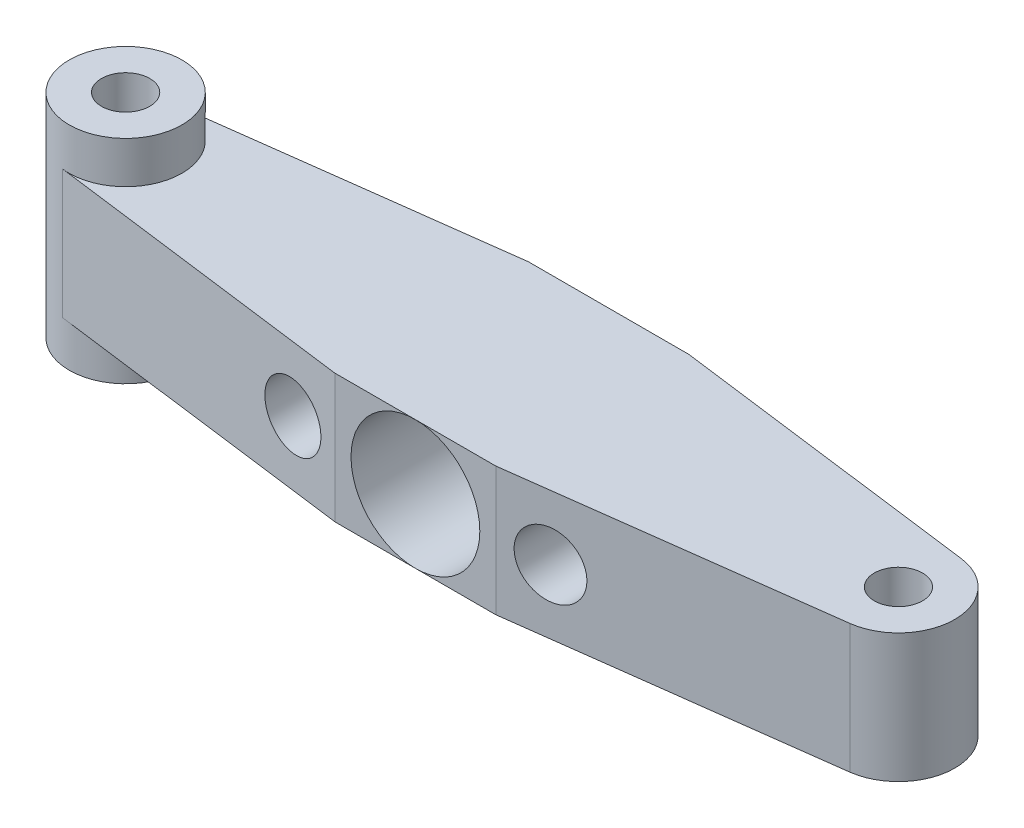
ISO-10303-21;
HEADER;
FILE_DESCRIPTION(('STEP AP214'),'2;1');
FILE_NAME('part.step','',(''),(''),'','','');
FILE_SCHEMA(('AUTOMOTIVE_DESIGN { 1 0 10303 214 1 1 1 1 }'));
ENDSEC;
DATA;
#1=APPLICATION_CONTEXT('core data for automotive mechanical design processes');
#2=APPLICATION_PROTOCOL_DEFINITION('international standard','automotive_design',2000,#1);
#3=PRODUCT_CONTEXT('',#1,'mechanical');
#4=PRODUCT('Part','Part','',(#3));
#5=PRODUCT_RELATED_PRODUCT_CATEGORY('part','',(#4));
#6=PRODUCT_DEFINITION_FORMATION('','',#4);
#7=PRODUCT_DEFINITION_CONTEXT('part definition',#1,'design');
#8=PRODUCT_DEFINITION('design','',#6,#7);
#9=PRODUCT_DEFINITION_SHAPE('','',#8);
#10=(LENGTH_UNIT() NAMED_UNIT(*) SI_UNIT(.MILLI.,.METRE.));
#11=(NAMED_UNIT(*) PLANE_ANGLE_UNIT() SI_UNIT($,.RADIAN.));
#12=(NAMED_UNIT(*) SI_UNIT($,.STERADIAN.) SOLID_ANGLE_UNIT());
#13=UNCERTAINTY_MEASURE_WITH_UNIT(LENGTH_MEASURE(1.E-05),#10,'distance_accuracy_value','');
#14=(GEOMETRIC_REPRESENTATION_CONTEXT(3) GLOBAL_UNCERTAINTY_ASSIGNED_CONTEXT((#13)) GLOBAL_UNIT_ASSIGNED_CONTEXT((#10,
#11,#12)) REPRESENTATION_CONTEXT('',''));
#15=CARTESIAN_POINT('',(0.,0.,0.));
#16=DIRECTION('',(0.,0.,1.));
#17=DIRECTION('',(1.,0.,0.));
#18=AXIS2_PLACEMENT_3D('',#15,#16,#17);
#19=CARTESIAN_POINT('',(-24.,6.6,0.));
#20=DIRECTION('',(0.,1.,0.));
#21=DIRECTION('',(1.,0.,0.));
#22=AXIS2_PLACEMENT_3D('',#19,#20,#21);
#23=PLANE('',#22);
#24=CARTESIAN_POINT('',(-24.,6.6,0.));
#25=DIRECTION('',(0.,-1.,0.));
#26=DIRECTION('',(0.,0.,-1.));
#27=AXIS2_PLACEMENT_3D('',#24,#25,#26);
#28=CIRCLE('',#27,1.5);
#29=CARTESIAN_POINT('',(-24.,6.6,1.5));
#30=VERTEX_POINT('',#29);
#31=EDGE_CURVE('E176',#30,#30,#28,.T.);
#32=ORIENTED_EDGE('',*,*,#31,.T.);
#33=EDGE_LOOP('',(#32));
#34=FACE_BOUND('',#33,.T.);
#35=CARTESIAN_POINT('',(-24.,6.6,0.));
#36=DIRECTION('',(0.,-1.,0.));
#37=DIRECTION('',(0.,0.,-1.));
#38=AXIS2_PLACEMENT_3D('',#35,#36,#37);
#39=CIRCLE('',#38,3.5);
#40=CARTESIAN_POINT('',(-24.,6.6,3.5));
#41=VERTEX_POINT('',#40);
#42=EDGE_CURVE('E244',#41,#41,#39,.T.);
#43=ORIENTED_EDGE('',*,*,#42,.F.);
#44=EDGE_LOOP('',(#43));
#45=FACE_BOUND('',#44,.T.);
#46=ADVANCED_FACE('F17',(#34,#45),#23,.T.);
#47=CARTESIAN_POINT('',(-24.,-6.6,0.));
#48=DIRECTION('',(0.,-1.,0.));
#49=DIRECTION('',(0.,0.,-1.));
#50=AXIS2_PLACEMENT_3D('',#47,#48,#49);
#51=PLANE('',#50);
#52=CARTESIAN_POINT('',(-24.,-6.6,0.));
#53=DIRECTION('',(0.,1.,0.));
#54=DIRECTION('',(0.,0.,-1.));
#55=AXIS2_PLACEMENT_3D('',#52,#53,#54);
#56=CIRCLE('',#55,1.5);
#57=CARTESIAN_POINT('',(-24.,-6.6,1.5));
#58=VERTEX_POINT('',#57);
#59=EDGE_CURVE('E256',#58,#58,#56,.T.);
#60=ORIENTED_EDGE('',*,*,#59,.T.);
#61=EDGE_LOOP('',(#60));
#62=FACE_BOUND('',#61,.T.);
#63=CARTESIAN_POINT('',(-24.,-6.6,0.));
#64=DIRECTION('',(0.,1.,0.));
#65=DIRECTION('',(0.,0.,-1.));
#66=AXIS2_PLACEMENT_3D('',#63,#64,#65);
#67=CIRCLE('',#66,3.5);
#68=CARTESIAN_POINT('',(-24.,-6.6,3.5));
#69=VERTEX_POINT('',#68);
#70=EDGE_CURVE('E182',#69,#69,#67,.T.);
#71=ORIENTED_EDGE('',*,*,#70,.F.);
#72=EDGE_LOOP('',(#71));
#73=FACE_BOUND('',#72,.T.);
#74=ADVANCED_FACE('F426',(#62,#73),#51,.T.);
#75=CARTESIAN_POINT('',(24.,4.,0.));
#76=DIRECTION('',(0.,-1.,0.));
#77=DIRECTION('',(0.,0.,-1.));
#78=AXIS2_PLACEMENT_3D('',#75,#76,#77);
#79=PLANE('',#78);
#80=CARTESIAN_POINT('',(24.,4.,0.));
#81=DIRECTION('',(0.,-1.,0.));
#82=DIRECTION('',(0.,0.,-1.));
#83=AXIS2_PLACEMENT_3D('',#80,#81,#82);
#84=CIRCLE('',#83,1.5);
#85=CARTESIAN_POINT('',(24.,4.,1.5));
#86=VERTEX_POINT('',#85);
#87=EDGE_CURVE('E192',#86,#86,#84,.T.);
#88=ORIENTED_EDGE('',*,*,#87,.T.);
#89=EDGE_LOOP('',(#88));
#90=FACE_BOUND('',#89,.T.);
#91=CARTESIAN_POINT('',(-24.,4.,0.));
#92=DIRECTION('',(0.,1.,0.));
#93=DIRECTION('',(0.,0.,-1.));
#94=AXIS2_PLACEMENT_3D('',#91,#92,#93);
#95=CIRCLE('',#94,3.5);
#96=CARTESIAN_POINT('',(-24.4512996225804,4.,3.47078213817295));
#97=VERTEX_POINT('',#96);
#98=CARTESIAN_POINT('',(-24.,4.,3.5));
#99=VERTEX_POINT('',#98);
#100=EDGE_CURVE('E245',#97,#99,#95,.T.);
#101=ORIENTED_EDGE('',*,*,#100,.F.);
#102=DIRECTION('',(0.991652039477905,0.,0.128942749308801));
#103=VECTOR('',#102,1.);
#104=CARTESIAN_POINT('',(-24.45129962258,4.,3.470782138173));
#105=LINE('',#104,#103);
#106=CARTESIAN_POINT('',(-5.,4.,6.));
#107=VERTEX_POINT('',#106);
#108=EDGE_CURVE('E186',#97,#107,#105,.T.);
#109=ORIENTED_EDGE('',*,*,#108,.T.);
#110=DIRECTION('',(1.,0.,0.));
#111=VECTOR('',#110,1.);
#112=CARTESIAN_POINT('',(-5.,4.,6.));
#113=LINE('',#112,#111);
#114=CARTESIAN_POINT('',(0.,4.,6.));
#115=VERTEX_POINT('',#114);
#116=EDGE_CURVE('E11',#107,#115,#113,.T.);
#117=ORIENTED_EDGE('',*,*,#116,.T.);
#118=DIRECTION('',(1.,0.,0.));
#119=VECTOR('',#118,1.);
#120=CARTESIAN_POINT('',(-5.,4.,6.));
#121=LINE('',#120,#119);
#122=CARTESIAN_POINT('',(5.,4.,6.));
#123=VERTEX_POINT('',#122);
#124=EDGE_CURVE('E250',#115,#123,#121,.T.);
#125=ORIENTED_EDGE('',*,*,#124,.T.);
#126=DIRECTION('',(0.991652039477905,0.,-0.128942749308801));
#127=VECTOR('',#126,1.);
#128=CARTESIAN_POINT('',(24.45129962258,4.,3.470782138173));
#129=LINE('',#128,#127);
#130=CARTESIAN_POINT('',(24.4512996225804,4.,3.47078213817295));
#131=VERTEX_POINT('',#130);
#132=EDGE_CURVE('E246',#123,#131,#129,.T.);
#133=ORIENTED_EDGE('',*,*,#132,.T.);
#134=CARTESIAN_POINT('',(24.,4.,0.));
#135=DIRECTION('',(0.,-1.,0.));
#136=DIRECTION('',(0.,0.,-1.));
#137=AXIS2_PLACEMENT_3D('',#134,#135,#136);
#138=CIRCLE('',#137,3.5);
#139=CARTESIAN_POINT('',(24.4512996225804,4.,-3.47078213817283));
#140=VERTEX_POINT('',#139);
#141=EDGE_CURVE('E207',#140,#131,#138,.T.);
#142=ORIENTED_EDGE('',*,*,#141,.F.);
#143=DIRECTION('',(-0.991652039477905,0.,-0.128942749308801));
#144=VECTOR('',#143,1.);
#145=CARTESIAN_POINT('',(24.45129962258,4.,-3.470782138173));
#146=LINE('',#145,#144);
#147=CARTESIAN_POINT('',(5.,4.,-6.));
#148=VERTEX_POINT('',#147);
#149=EDGE_CURVE('E222',#140,#148,#146,.T.);
#150=ORIENTED_EDGE('',*,*,#149,.T.);
#151=DIRECTION('',(-1.,0.,0.));
#152=VECTOR('',#151,1.);
#153=CARTESIAN_POINT('',(-5.,4.,-6.));
#154=LINE('',#153,#152);
#155=CARTESIAN_POINT('',(0.,4.,-6.));
#156=VERTEX_POINT('',#155);
#157=EDGE_CURVE('E197',#148,#156,#154,.T.);
#158=ORIENTED_EDGE('',*,*,#157,.T.);
#159=DIRECTION('',(-1.,0.,0.));
#160=VECTOR('',#159,1.);
#161=CARTESIAN_POINT('',(-5.,4.,-6.));
#162=LINE('',#161,#160);
#163=CARTESIAN_POINT('',(-5.,4.,-6.));
#164=VERTEX_POINT('',#163);
#165=EDGE_CURVE('E196',#156,#164,#162,.T.);
#166=ORIENTED_EDGE('',*,*,#165,.T.);
#167=DIRECTION('',(-0.991652039477905,0.,0.128942749308801));
#168=VECTOR('',#167,1.);
#169=CARTESIAN_POINT('',(-24.45129962258,4.,-3.470782138173));
#170=LINE('',#169,#168);
#171=CARTESIAN_POINT('',(-24.4512996225804,4.,-3.47078213817295));
#172=VERTEX_POINT('',#171);
#173=EDGE_CURVE('E212',#164,#172,#170,.T.);
#174=ORIENTED_EDGE('',*,*,#173,.T.);
#175=CARTESIAN_POINT('',(-24.,4.,0.));
#176=DIRECTION('',(0.,1.,0.));
#177=DIRECTION('',(0.,0.,-1.));
#178=AXIS2_PLACEMENT_3D('',#175,#176,#177);
#179=CIRCLE('',#178,3.5);
#180=EDGE_CURVE('E281',#99,#172,#179,.T.);
#181=ORIENTED_EDGE('',*,*,#180,.F.);
#182=EDGE_LOOP('',(#101,#109,#117,#125,#133,#142,#150,#158,#166,#174,#181));
#183=FACE_BOUND('',#182,.T.);
#184=ADVANCED_FACE('F320',(#90,#183),#79,.F.);
#185=CARTESIAN_POINT('',(-5.,4.,6.));
#186=DIRECTION('',(0.,0.,-1.));
#187=DIRECTION('',(0.,-1.,0.));
#188=AXIS2_PLACEMENT_3D('',#185,#186,#187);
#189=PLANE('',#188);
#190=DIRECTION('',(0.,-1.,0.));
#191=VECTOR('',#190,1.);
#192=CARTESIAN_POINT('',(-5.,4.,6.));
#193=LINE('',#192,#191);
#194=CARTESIAN_POINT('',(-4.99999999999981,-4.,6.));
#195=VERTEX_POINT('',#194);
#196=EDGE_CURVE('E28',#107,#195,#193,.T.);
#197=ORIENTED_EDGE('',*,*,#196,.T.);
#198=DIRECTION('',(-1.,0.,0.));
#199=VECTOR('',#198,1.);
#200=CARTESIAN_POINT('',(24.,-4.,6.));
#201=LINE('',#200,#199);
#202=CARTESIAN_POINT('',(0.,-4.,6.));
#203=VERTEX_POINT('',#202);
#204=EDGE_CURVE('E239',#203,#195,#201,.T.);
#205=ORIENTED_EDGE('',*,*,#204,.F.);
#206=CARTESIAN_POINT('',(0.,0.,6.));
#207=DIRECTION('',(0.,0.,1.));
#208=DIRECTION('',(1.,0.,0.));
#209=AXIS2_PLACEMENT_3D('',#206,#207,#208);
#210=CIRCLE('',#209,4.);
#211=CARTESIAN_POINT('',(-4.,0.,6.));
#212=VERTEX_POINT('',#211);
#213=EDGE_CURVE('E230',#212,#203,#210,.T.);
#214=ORIENTED_EDGE('',*,*,#213,.F.);
#215=CARTESIAN_POINT('',(0.,0.,6.));
#216=DIRECTION('',(0.,0.,1.));
#217=DIRECTION('',(1.,0.,0.));
#218=AXIS2_PLACEMENT_3D('',#215,#216,#217);
#219=CIRCLE('',#218,4.);
#220=EDGE_CURVE('E198',#115,#212,#219,.T.);
#221=ORIENTED_EDGE('',*,*,#220,.F.);
#222=ORIENTED_EDGE('',*,*,#116,.F.);
#223=EDGE_LOOP('',(#197,#205,#214,#221,#222));
#224=FACE_BOUND('',#223,.T.);
#225=ADVANCED_FACE('F372',(#224),#189,.F.);
#226=CARTESIAN_POINT('',(-24.45129962258,4.,3.470782138173));
#227=DIRECTION('',(0.128942749308801,0.,-0.991652039477905));
#228=DIRECTION('',(0.,-1.,0.));
#229=AXIS2_PLACEMENT_3D('',#226,#227,#228);
#230=PLANE('',#229);
#231=CARTESIAN_POINT('',(-8.,0.,5.60991534073781));
#232=DIRECTION('',(-0.128942749308801,0.,0.991652039477905));
#233=DIRECTION('',(0.991652039477905,0.,0.128942749308801));
#234=AXIS2_PLACEMENT_3D('',#231,#232,#233);
#235=ELLIPSE('',#234,2.01683647124145,2.);
#236=CARTESIAN_POINT('',(-10.,0.,5.34985890122968));
#237=VERTEX_POINT('',#236);
#238=EDGE_CURVE('E168',#237,#237,#235,.T.);
#239=ORIENTED_EDGE('',*,*,#238,.F.);
#240=EDGE_LOOP('',(#239));
#241=FACE_BOUND('',#240,.T.);
#242=ORIENTED_EDGE('',*,*,#108,.F.);
#243=DIRECTION('',(0.,1.,0.));
#244=VECTOR('',#243,1.);
#245=CARTESIAN_POINT('',(-24.45129962258,4.,3.470782138173));
#246=LINE('',#245,#244);
#247=CARTESIAN_POINT('',(-24.4512996225804,-4.,3.47078213817295));
#248=VERTEX_POINT('',#247);
#249=EDGE_CURVE('E262',#248,#97,#246,.T.);
#250=ORIENTED_EDGE('',*,*,#249,.F.);
#251=DIRECTION('',(-0.991652039477905,0.,-0.1289427493088));
#252=VECTOR('',#251,1.);
#253=CARTESIAN_POINT('',(-5.,-4.,6.));
#254=LINE('',#253,#252);
#255=EDGE_CURVE('E234',#195,#248,#254,.T.);
#256=ORIENTED_EDGE('',*,*,#255,.F.);
#257=ORIENTED_EDGE('',*,*,#196,.F.);
#258=EDGE_LOOP('',(#242,#250,#256,#257));
#259=FACE_BOUND('',#258,.T.);
#260=ADVANCED_FACE('F375',(#241,#259),#230,.F.);
#261=CARTESIAN_POINT('',(-24.45129962258,4.,-3.470782138173));
#262=DIRECTION('',(0.128942749308801,0.,0.991652039477905));
#263=DIRECTION('',(0.,-1.,0.));
#264=AXIS2_PLACEMENT_3D('',#261,#262,#263);
#265=PLANE('',#264);
#266=CARTESIAN_POINT('',(-8.,0.,-5.60991534073781));
#267=DIRECTION('',(-0.128942749308801,0.,-0.991652039477905));
#268=DIRECTION('',(0.991652039477905,0.,-0.128942749308801));
#269=AXIS2_PLACEMENT_3D('',#266,#267,#268);
#270=ELLIPSE('',#269,2.01683647124145,2.);
#271=CARTESIAN_POINT('',(-10.,0.,-5.34985890122968));
#272=VERTEX_POINT('',#271);
#273=EDGE_CURVE('E166',#272,#272,#270,.T.);
#274=ORIENTED_EDGE('',*,*,#273,.F.);
#275=EDGE_LOOP('',(#274));
#276=FACE_BOUND('',#275,.T.);
#277=ORIENTED_EDGE('',*,*,#173,.F.);
#278=DIRECTION('',(0.,-1.,0.));
#279=VECTOR('',#278,1.);
#280=CARTESIAN_POINT('',(-5.,4.,-6.));
#281=LINE('',#280,#279);
#282=CARTESIAN_POINT('',(-5.,-4.,-6.));
#283=VERTEX_POINT('',#282);
#284=EDGE_CURVE('E193',#164,#283,#281,.T.);
#285=ORIENTED_EDGE('',*,*,#284,.T.);
#286=DIRECTION('',(0.991652039477905,0.,-0.1289427493088));
#287=VECTOR('',#286,1.);
#288=CARTESIAN_POINT('',(-24.45129962258,-4.,-3.470782138173));
#289=LINE('',#288,#287);
#290=CARTESIAN_POINT('',(-24.4512996225804,-4.,-3.47078213817295));
#291=VERTEX_POINT('',#290);
#292=EDGE_CURVE('E238',#291,#283,#289,.T.);
#293=ORIENTED_EDGE('',*,*,#292,.F.);
#294=DIRECTION('',(0.,-1.,0.));
#295=VECTOR('',#294,1.);
#296=CARTESIAN_POINT('',(-24.45129962258,4.,-3.470782138173));
#297=LINE('',#296,#295);
#298=EDGE_CURVE('E290',#172,#291,#297,.T.);
#299=ORIENTED_EDGE('',*,*,#298,.F.);
#300=EDGE_LOOP('',(#277,#285,#293,#299));
#301=FACE_BOUND('',#300,.T.);
#302=ADVANCED_FACE('F412',(#276,#301),#265,.F.);
#303=CARTESIAN_POINT('',(-5.,4.,-6.));
#304=DIRECTION('',(0.,0.,1.));
#305=DIRECTION('',(1.,0.,0.));
#306=AXIS2_PLACEMENT_3D('',#303,#304,#305);
#307=PLANE('',#306);
#308=DIRECTION('',(1.,0.,0.));
#309=VECTOR('',#308,1.);
#310=CARTESIAN_POINT('',(24.,-4.,-6.));
#311=LINE('',#310,#309);
#312=CARTESIAN_POINT('',(0.,-4.,-6.));
#313=VERTEX_POINT('',#312);
#314=EDGE_CURVE('E331',#283,#313,#311,.T.);
#315=ORIENTED_EDGE('',*,*,#314,.F.);
#316=ORIENTED_EDGE('',*,*,#284,.F.);
#317=ORIENTED_EDGE('',*,*,#165,.F.);
#318=CARTESIAN_POINT('',(0.,0.,-6.));
#319=DIRECTION('',(0.,0.,-1.));
#320=DIRECTION('',(1.,0.,0.));
#321=AXIS2_PLACEMENT_3D('',#318,#319,#320);
#322=CIRCLE('',#321,4.);
#323=CARTESIAN_POINT('',(-4.,0.,-6.));
#324=VERTEX_POINT('',#323);
#325=EDGE_CURVE('E201',#324,#156,#322,.T.);
#326=ORIENTED_EDGE('',*,*,#325,.F.);
#327=CARTESIAN_POINT('',(0.,0.,-6.));
#328=DIRECTION('',(0.,0.,-1.));
#329=DIRECTION('',(1.,0.,0.));
#330=AXIS2_PLACEMENT_3D('',#327,#328,#329);
#331=CIRCLE('',#330,4.);
#332=EDGE_CURVE('E401',#313,#324,#331,.T.);
#333=ORIENTED_EDGE('',*,*,#332,.F.);
#334=EDGE_LOOP('',(#315,#316,#317,#326,#333));
#335=FACE_BOUND('',#334,.T.);
#336=ADVANCED_FACE('F414',(#335),#307,.F.);
#337=CARTESIAN_POINT('',(-5.,4.,-6.));
#338=DIRECTION('',(0.,0.,1.));
#339=DIRECTION('',(1.,0.,0.));
#340=AXIS2_PLACEMENT_3D('',#337,#338,#339);
#341=PLANE('',#340);
#342=DIRECTION('',(0.,-1.,0.));
#343=VECTOR('',#342,1.);
#344=CARTESIAN_POINT('',(5.,4.,-6.));
#345=LINE('',#344,#343);
#346=CARTESIAN_POINT('',(5.,-4.,-6.));
#347=VERTEX_POINT('',#346);
#348=EDGE_CURVE('E226',#148,#347,#345,.T.);
#349=ORIENTED_EDGE('',*,*,#348,.T.);
#350=DIRECTION('',(1.,0.,0.));
#351=VECTOR('',#350,1.);
#352=CARTESIAN_POINT('',(24.,-4.,-6.));
#353=LINE('',#352,#351);
#354=EDGE_CURVE('E275',#313,#347,#353,.T.);
#355=ORIENTED_EDGE('',*,*,#354,.F.);
#356=CARTESIAN_POINT('',(0.,0.,-6.));
#357=DIRECTION('',(0.,0.,-1.));
#358=DIRECTION('',(1.,0.,0.));
#359=AXIS2_PLACEMENT_3D('',#356,#357,#358);
#360=CIRCLE('',#359,4.);
#361=EDGE_CURVE('E289',#156,#313,#360,.T.);
#362=ORIENTED_EDGE('',*,*,#361,.F.);
#363=ORIENTED_EDGE('',*,*,#157,.F.);
#364=EDGE_LOOP('',(#349,#355,#362,#363));
#365=FACE_BOUND('',#364,.T.);
#366=ADVANCED_FACE('F312',(#365),#341,.F.);
#367=CARTESIAN_POINT('',(24.45129962258,4.,-3.470782138173));
#368=DIRECTION('',(-0.128942749308801,0.,0.991652039477905));
#369=DIRECTION('',(0.,1.,0.));
#370=AXIS2_PLACEMENT_3D('',#367,#368,#369);
#371=PLANE('',#370);
#372=CARTESIAN_POINT('',(8.,0.,-5.60991534073781));
#373=DIRECTION('',(0.128942749308801,0.,-0.991652039477905));
#374=DIRECTION('',(0.991652039477905,0.,0.128942749308801));
#375=AXIS2_PLACEMENT_3D('',#372,#373,#374);
#376=ELLIPSE('',#375,2.01683647124145,2.);
#377=CARTESIAN_POINT('',(6.,0.,-5.86997178024595));
#378=VERTEX_POINT('',#377);
#379=EDGE_CURVE('E270',#378,#378,#376,.T.);
#380=ORIENTED_EDGE('',*,*,#379,.F.);
#381=EDGE_LOOP('',(#380));
#382=FACE_BOUND('',#381,.T.);
#383=ORIENTED_EDGE('',*,*,#149,.F.);
#384=DIRECTION('',(0.,1.,0.));
#385=VECTOR('',#384,1.);
#386=CARTESIAN_POINT('',(24.45129962258,4.,-3.47078213817277));
#387=LINE('',#386,#385);
#388=CARTESIAN_POINT('',(24.4512996225804,-4.,-3.47078213817283));
#389=VERTEX_POINT('',#388);
#390=EDGE_CURVE('E203',#389,#140,#387,.T.);
#391=ORIENTED_EDGE('',*,*,#390,.F.);
#392=DIRECTION('',(0.991652039477905,0.,0.1289427493088));
#393=VECTOR('',#392,1.);
#394=CARTESIAN_POINT('',(5.,-4.,-6.));
#395=LINE('',#394,#393);
#396=EDGE_CURVE('E218',#347,#389,#395,.T.);
#397=ORIENTED_EDGE('',*,*,#396,.F.);
#398=ORIENTED_EDGE('',*,*,#348,.F.);
#399=EDGE_LOOP('',(#383,#391,#397,#398));
#400=FACE_BOUND('',#399,.T.);
#401=ADVANCED_FACE('F308',(#382,#400),#371,.F.);
#402=CARTESIAN_POINT('',(24.,4.,0.));
#403=DIRECTION('',(0.,-1.,0.));
#404=DIRECTION('',(0.,0.,-1.));
#405=AXIS2_PLACEMENT_3D('',#402,#403,#404);
#406=CYLINDRICAL_SURFACE('',#405,3.5);
#407=DIRECTION('',(0.,-1.,0.));
#408=VECTOR('',#407,1.);
#409=CARTESIAN_POINT('',(24.45129962258,4.,3.470782138173));
#410=LINE('',#409,#408);
#411=CARTESIAN_POINT('',(24.4512996225804,-4.,3.47078213817295));
#412=VERTEX_POINT('',#411);
#413=EDGE_CURVE('E208',#131,#412,#410,.T.);
#414=ORIENTED_EDGE('',*,*,#413,.T.);
#415=CARTESIAN_POINT('',(24.,-4.,0.));
#416=DIRECTION('',(0.,-1.,0.));
#417=DIRECTION('',(0.,0.,-1.));
#418=AXIS2_PLACEMENT_3D('',#415,#416,#417);
#419=CIRCLE('',#418,3.5);
#420=EDGE_CURVE('E213',#389,#412,#419,.T.);
#421=ORIENTED_EDGE('',*,*,#420,.F.);
#422=ORIENTED_EDGE('',*,*,#390,.T.);
#423=ORIENTED_EDGE('',*,*,#141,.T.);
#424=EDGE_LOOP('',(#414,#421,#422,#423));
#425=FACE_BOUND('',#424,.T.);
#426=ADVANCED_FACE('F311',(#425),#406,.T.);
#427=CARTESIAN_POINT('',(24.45129962258,4.,3.470782138173));
#428=DIRECTION('',(-0.128942749308801,0.,-0.991652039477905));
#429=DIRECTION('',(-0.991652039477905,0.,0.128942749308801));
#430=AXIS2_PLACEMENT_3D('',#427,#428,#429);
#431=PLANE('',#430);
#432=CARTESIAN_POINT('',(8.,0.,5.60991534073781));
#433=DIRECTION('',(0.128942749308801,0.,0.991652039477905));
#434=DIRECTION('',(0.991652039477905,0.,-0.128942749308801));
#435=AXIS2_PLACEMENT_3D('',#432,#433,#434);
#436=ELLIPSE('',#435,2.01683647124145,2.);
#437=CARTESIAN_POINT('',(6.,0.,5.86997178024594));
#438=VERTEX_POINT('',#437);
#439=EDGE_CURVE('E178',#438,#438,#436,.T.);
#440=ORIENTED_EDGE('',*,*,#439,.F.);
#441=EDGE_LOOP('',(#440));
#442=FACE_BOUND('',#441,.T.);
#443=ORIENTED_EDGE('',*,*,#132,.F.);
#444=DIRECTION('',(0.,-1.,0.));
#445=VECTOR('',#444,1.);
#446=CARTESIAN_POINT('',(5.,4.,6.));
#447=LINE('',#446,#445);
#448=CARTESIAN_POINT('',(5.,-4.,6.));
#449=VERTEX_POINT('',#448);
#450=EDGE_CURVE('E217',#123,#449,#447,.T.);
#451=ORIENTED_EDGE('',*,*,#450,.T.);
#452=DIRECTION('',(-0.991652039477905,0.,0.1289427493088));
#453=VECTOR('',#452,1.);
#454=CARTESIAN_POINT('',(24.45129962258,-4.,3.470782138173));
#455=LINE('',#454,#453);
#456=EDGE_CURVE('E251',#412,#449,#455,.T.);
#457=ORIENTED_EDGE('',*,*,#456,.F.);
#458=ORIENTED_EDGE('',*,*,#413,.F.);
#459=EDGE_LOOP('',(#443,#451,#457,#458));
#460=FACE_BOUND('',#459,.T.);
#461=ADVANCED_FACE('F436',(#442,#460),#431,.F.);
#462=CARTESIAN_POINT('',(-5.,4.,6.));
#463=DIRECTION('',(0.,0.,-1.));
#464=DIRECTION('',(0.,-1.,0.));
#465=AXIS2_PLACEMENT_3D('',#462,#463,#464);
#466=PLANE('',#465);
#467=DIRECTION('',(-1.,0.,0.));
#468=VECTOR('',#467,1.);
#469=CARTESIAN_POINT('',(24.,-4.,6.));
#470=LINE('',#469,#468);
#471=EDGE_CURVE('E255',#449,#203,#470,.T.);
#472=ORIENTED_EDGE('',*,*,#471,.F.);
#473=ORIENTED_EDGE('',*,*,#450,.F.);
#474=ORIENTED_EDGE('',*,*,#124,.F.);
#475=CARTESIAN_POINT('',(0.,0.,6.));
#476=DIRECTION('',(0.,0.,1.));
#477=DIRECTION('',(1.,0.,0.));
#478=AXIS2_PLACEMENT_3D('',#475,#476,#477);
#479=CIRCLE('',#478,4.);
#480=EDGE_CURVE('E202',#203,#115,#479,.T.);
#481=ORIENTED_EDGE('',*,*,#480,.F.);
#482=EDGE_LOOP('',(#472,#473,#474,#481));
#483=FACE_BOUND('',#482,.T.);
#484=ADVANCED_FACE('F439',(#483),#466,.F.);
#485=CARTESIAN_POINT('',(24.,-4.,0.));
#486=DIRECTION('',(0.,-1.,0.));
#487=DIRECTION('',(0.,0.,-1.));
#488=AXIS2_PLACEMENT_3D('',#485,#486,#487);
#489=PLANE('',#488);
#490=CARTESIAN_POINT('',(24.,-4.,0.));
#491=DIRECTION('',(0.,1.,0.));
#492=DIRECTION('',(0.,0.,-1.));
#493=AXIS2_PLACEMENT_3D('',#490,#491,#492);
#494=CIRCLE('',#493,1.5);
#495=CARTESIAN_POINT('',(24.,-4.,1.5));
#496=VERTEX_POINT('',#495);
#497=EDGE_CURVE('E191',#496,#496,#494,.T.);
#498=ORIENTED_EDGE('',*,*,#497,.T.);
#499=EDGE_LOOP('',(#498));
#500=FACE_BOUND('',#499,.T.);
#501=ORIENTED_EDGE('',*,*,#456,.T.);
#502=ORIENTED_EDGE('',*,*,#471,.T.);
#503=ORIENTED_EDGE('',*,*,#204,.T.);
#504=ORIENTED_EDGE('',*,*,#255,.T.);
#505=CARTESIAN_POINT('',(-24.,-4.,0.));
#506=DIRECTION('',(0.,1.,0.));
#507=DIRECTION('',(0.,0.,-1.));
#508=AXIS2_PLACEMENT_3D('',#505,#506,#507);
#509=CIRCLE('',#508,3.5);
#510=CARTESIAN_POINT('',(-24.,-4.,3.5));
#511=VERTEX_POINT('',#510);
#512=EDGE_CURVE('E263',#248,#511,#509,.T.);
#513=ORIENTED_EDGE('',*,*,#512,.T.);
#514=CARTESIAN_POINT('',(-24.,-4.,0.));
#515=DIRECTION('',(0.,1.,0.));
#516=DIRECTION('',(0.,0.,-1.));
#517=AXIS2_PLACEMENT_3D('',#514,#515,#516);
#518=CIRCLE('',#517,3.5);
#519=EDGE_CURVE('E285',#511,#291,#518,.T.);
#520=ORIENTED_EDGE('',*,*,#519,.T.);
#521=ORIENTED_EDGE('',*,*,#292,.T.);
#522=ORIENTED_EDGE('',*,*,#314,.T.);
#523=ORIENTED_EDGE('',*,*,#354,.T.);
#524=ORIENTED_EDGE('',*,*,#396,.T.);
#525=ORIENTED_EDGE('',*,*,#420,.T.);
#526=EDGE_LOOP('',(#501,#502,#503,#504,#513,#520,#521,#522,#523,#524,#525));
#527=FACE_BOUND('',#526,.T.);
#528=ADVANCED_FACE('F327',(#500,#527),#489,.T.);
#529=CARTESIAN_POINT('',(-24.,4.,0.));
#530=DIRECTION('',(0.,-1.,0.));
#531=DIRECTION('',(0.,0.,-1.));
#532=AXIS2_PLACEMENT_3D('',#529,#530,#531);
#533=CYLINDRICAL_SURFACE('',#532,1.5);
#534=ORIENTED_EDGE('',*,*,#31,.F.);
#535=DIRECTION('',(0.,-1.,0.));
#536=VECTOR('',#535,1.);
#537=CARTESIAN_POINT('',(-24.,4.,1.5));
#538=LINE('',#537,#536);
#539=EDGE_CURVE('E294',#30,#58,#538,.T.);
#540=ORIENTED_EDGE('',*,*,#539,.T.);
#541=ORIENTED_EDGE('',*,*,#59,.F.);
#542=ORIENTED_EDGE('',*,*,#539,.F.);
#543=EDGE_LOOP('',(#534,#540,#541,#542));
#544=FACE_BOUND('',#543,.T.);
#545=ADVANCED_FACE('F454',(#544),#533,.F.);
#546=CARTESIAN_POINT('',(-8.,0.,-6.));
#547=DIRECTION('',(0.,0.,1.));
#548=DIRECTION('',(1.,0.,0.));
#549=AXIS2_PLACEMENT_3D('',#546,#547,#548);
#550=CYLINDRICAL_SURFACE('',#549,2.);
#551=ORIENTED_EDGE('',*,*,#273,.T.);
#552=DIRECTION('',(0.,0.,1.));
#553=VECTOR('',#552,1.);
#554=CARTESIAN_POINT('',(-10.,0.,-6.));
#555=LINE('',#554,#553);
#556=EDGE_CURVE('E163',#272,#237,#555,.T.);
#557=ORIENTED_EDGE('',*,*,#556,.T.);
#558=ORIENTED_EDGE('',*,*,#238,.T.);
#559=ORIENTED_EDGE('',*,*,#556,.F.);
#560=EDGE_LOOP('',(#551,#557,#558,#559));
#561=FACE_BOUND('',#560,.T.);
#562=ADVANCED_FACE('F164',(#561),#550,.F.);
#563=CARTESIAN_POINT('',(8.,0.,-6.));
#564=DIRECTION('',(0.,0.,1.));
#565=DIRECTION('',(1.,0.,0.));
#566=AXIS2_PLACEMENT_3D('',#563,#564,#565);
#567=CYLINDRICAL_SURFACE('',#566,2.);
#568=ORIENTED_EDGE('',*,*,#379,.T.);
#569=DIRECTION('',(0.,0.,1.));
#570=VECTOR('',#569,1.);
#571=CARTESIAN_POINT('',(6.,0.,-6.));
#572=LINE('',#571,#570);
#573=EDGE_CURVE('E229',#378,#438,#572,.T.);
#574=ORIENTED_EDGE('',*,*,#573,.T.);
#575=ORIENTED_EDGE('',*,*,#439,.T.);
#576=ORIENTED_EDGE('',*,*,#573,.F.);
#577=EDGE_LOOP('',(#568,#574,#575,#576));
#578=FACE_BOUND('',#577,.T.);
#579=ADVANCED_FACE('F306',(#578),#567,.F.);
#580=CARTESIAN_POINT('',(0.,0.,-6.));
#581=DIRECTION('',(0.,0.,1.));
#582=DIRECTION('',(1.,0.,0.));
#583=AXIS2_PLACEMENT_3D('',#580,#581,#582);
#584=CYLINDRICAL_SURFACE('',#583,4.);
#585=ORIENTED_EDGE('',*,*,#361,.T.);
#586=ORIENTED_EDGE('',*,*,#332,.T.);
#587=DIRECTION('',(0.,0.,1.));
#588=VECTOR('',#587,1.);
#589=CARTESIAN_POINT('',(-4.,0.,-6.));
#590=LINE('',#589,#588);
#591=EDGE_CURVE('E21',#324,#212,#590,.T.);
#592=ORIENTED_EDGE('',*,*,#591,.T.);
#593=ORIENTED_EDGE('',*,*,#213,.T.);
#594=ORIENTED_EDGE('',*,*,#480,.T.);
#595=ORIENTED_EDGE('',*,*,#220,.T.);
#596=ORIENTED_EDGE('',*,*,#591,.F.);
#597=ORIENTED_EDGE('',*,*,#325,.T.);
#598=EDGE_LOOP('',(#585,#586,#592,#593,#594,#595,#596,#597));
#599=FACE_BOUND('',#598,.T.);
#600=ADVANCED_FACE('F19',(#599),#584,.F.);
#601=CARTESIAN_POINT('',(-24.,4.,0.));
#602=DIRECTION('',(0.,-1.,0.));
#603=DIRECTION('',(0.,0.,-1.));
#604=AXIS2_PLACEMENT_3D('',#601,#602,#603);
#605=CYLINDRICAL_SURFACE('',#604,3.5);
#606=ORIENTED_EDGE('',*,*,#70,.T.);
#607=DIRECTION('',(0.,1.,0.));
#608=VECTOR('',#607,1.);
#609=CARTESIAN_POINT('',(-24.,4.,3.5));
#610=LINE('',#609,#608);
#611=EDGE_CURVE('E267',#69,#511,#610,.T.);
#612=ORIENTED_EDGE('',*,*,#611,.T.);
#613=ORIENTED_EDGE('',*,*,#512,.F.);
#614=ORIENTED_EDGE('',*,*,#249,.T.);
#615=ORIENTED_EDGE('',*,*,#100,.T.);
#616=DIRECTION('',(0.,1.,0.));
#617=VECTOR('',#616,1.);
#618=CARTESIAN_POINT('',(-24.,4.,3.5));
#619=LINE('',#618,#617);
#620=EDGE_CURVE('E240',#99,#41,#619,.T.);
#621=ORIENTED_EDGE('',*,*,#620,.T.);
#622=ORIENTED_EDGE('',*,*,#42,.T.);
#623=ORIENTED_EDGE('',*,*,#620,.F.);
#624=ORIENTED_EDGE('',*,*,#180,.T.);
#625=ORIENTED_EDGE('',*,*,#298,.T.);
#626=ORIENTED_EDGE('',*,*,#519,.F.);
#627=ORIENTED_EDGE('',*,*,#611,.F.);
#628=EDGE_LOOP('',(#606,#612,#613,#614,#615,#621,#622,#623,#624,#625,#626,#627));
#629=FACE_BOUND('',#628,.T.);
#630=ADVANCED_FACE('F380',(#629),#605,.T.);
#631=CARTESIAN_POINT('',(24.,4.,0.));
#632=DIRECTION('',(0.,-1.,0.));
#633=DIRECTION('',(0.,0.,-1.));
#634=AXIS2_PLACEMENT_3D('',#631,#632,#633);
#635=CYLINDRICAL_SURFACE('',#634,1.5);
#636=ORIENTED_EDGE('',*,*,#87,.F.);
#637=DIRECTION('',(0.,-1.,0.));
#638=VECTOR('',#637,1.);
#639=CARTESIAN_POINT('',(24.,4.,1.5));
#640=LINE('',#639,#638);
#641=EDGE_CURVE('E187',#86,#496,#640,.T.);
#642=ORIENTED_EDGE('',*,*,#641,.T.);
#643=ORIENTED_EDGE('',*,*,#497,.F.);
#644=ORIENTED_EDGE('',*,*,#641,.F.);
#645=EDGE_LOOP('',(#636,#642,#643,#644));
#646=FACE_BOUND('',#645,.T.);
#647=ADVANCED_FACE('F447',(#646),#635,.F.);
#648=CLOSED_SHELL('',(#46,#74,#184,#225,#260,#302,#336,#366,#401,#426,#461,#484,#528,#545,#562,
#579,#600,#630,#647));
#649=MANIFOLD_SOLID_BREP('B1',#648);
#650=ADVANCED_BREP_SHAPE_REPRESENTATION('',(#18,#649),#14);
#651=SHAPE_DEFINITION_REPRESENTATION(#9,#650);
ENDSEC;
END-ISO-10303-21;
